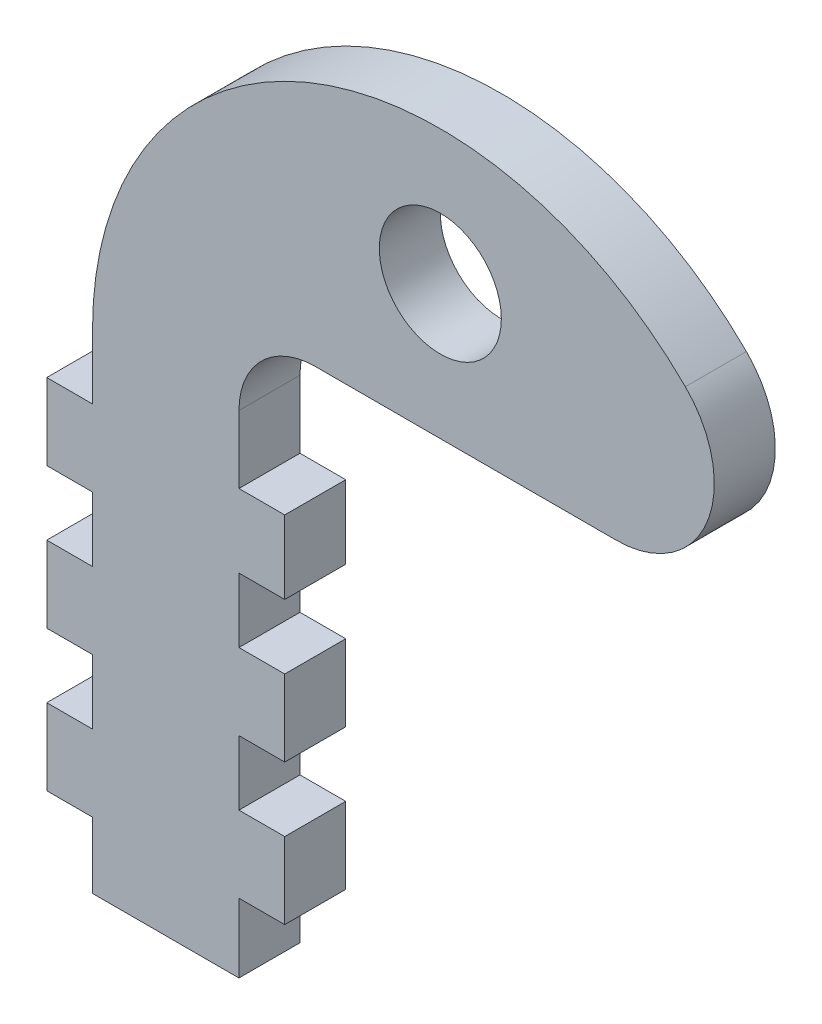
ISO-10303-21;
HEADER;
FILE_DESCRIPTION(('STEP AP214'),'2;1');
FILE_NAME('part.step','',(''),(''),'','','');
FILE_SCHEMA(('AUTOMOTIVE_DESIGN { 1 0 10303 214 1 1 1 1 }'));
ENDSEC;
DATA;
#1=APPLICATION_CONTEXT('core data for automotive mechanical design processes');
#2=APPLICATION_PROTOCOL_DEFINITION('international standard','automotive_design',2000,#1);
#3=PRODUCT_CONTEXT('',#1,'mechanical');
#4=PRODUCT('Part','Part','',(#3));
#5=PRODUCT_RELATED_PRODUCT_CATEGORY('part','',(#4));
#6=PRODUCT_DEFINITION_FORMATION('','',#4);
#7=PRODUCT_DEFINITION_CONTEXT('part definition',#1,'design');
#8=PRODUCT_DEFINITION('design','',#6,#7);
#9=PRODUCT_DEFINITION_SHAPE('','',#8);
#10=(LENGTH_UNIT() NAMED_UNIT(*) SI_UNIT(.MILLI.,.METRE.));
#11=(NAMED_UNIT(*) PLANE_ANGLE_UNIT() SI_UNIT($,.RADIAN.));
#12=(NAMED_UNIT(*) SI_UNIT($,.STERADIAN.) SOLID_ANGLE_UNIT());
#13=UNCERTAINTY_MEASURE_WITH_UNIT(LENGTH_MEASURE(1.E-05),#10,'distance_accuracy_value','');
#14=(GEOMETRIC_REPRESENTATION_CONTEXT(3) GLOBAL_UNCERTAINTY_ASSIGNED_CONTEXT((#13)) GLOBAL_UNIT_ASSIGNED_CONTEXT((#10,
#11,#12)) REPRESENTATION_CONTEXT('',''));
#15=CARTESIAN_POINT('',(0.,0.,0.));
#16=DIRECTION('',(0.,0.,1.));
#17=DIRECTION('',(1.,0.,0.));
#18=AXIS2_PLACEMENT_3D('',#15,#16,#17);
#19=CARTESIAN_POINT('',(0.,-23.23,4.));
#20=DIRECTION('',(0.,-1.,0.));
#21=DIRECTION('',(0.,0.,-1.));
#22=AXIS2_PLACEMENT_3D('',#19,#20,#21);
#23=PLANE('',#22);
#24=DIRECTION('',(-1.,0.,0.));
#25=VECTOR('',#24,1.);
#26=CARTESIAN_POINT('',(0.,-23.23,0.));
#27=LINE('',#26,#25);
#28=CARTESIAN_POINT('',(-4.8,-23.23,0.));
#29=VERTEX_POINT('',#28);
#30=CARTESIAN_POINT('',(-7.8,-23.23,0.));
#31=VERTEX_POINT('',#30);
#32=EDGE_CURVE('E271',#29,#31,#27,.T.);
#33=ORIENTED_EDGE('',*,*,#32,.F.);
#34=DIRECTION('',(0.,0.,-1.));
#35=VECTOR('',#34,1.);
#36=CARTESIAN_POINT('',(-4.8,-23.23,4.));
#37=LINE('',#36,#35);
#38=CARTESIAN_POINT('',(-4.8,-23.23,4.));
#39=VERTEX_POINT('',#38);
#40=EDGE_CURVE('E11',#39,#29,#37,.T.);
#41=ORIENTED_EDGE('',*,*,#40,.F.);
#42=DIRECTION('',(-1.,0.,0.));
#43=VECTOR('',#42,1.);
#44=CARTESIAN_POINT('',(0.,-23.23,4.));
#45=LINE('',#44,#43);
#46=CARTESIAN_POINT('',(-7.8,-23.23,4.));
#47=VERTEX_POINT('',#46);
#48=EDGE_CURVE('E360',#39,#47,#45,.T.);
#49=ORIENTED_EDGE('',*,*,#48,.T.);
#50=DIRECTION('',(0.,0.,-1.));
#51=VECTOR('',#50,1.);
#52=CARTESIAN_POINT('',(-7.8,-23.23,4.));
#53=LINE('',#52,#51);
#54=EDGE_CURVE('E52',#47,#31,#53,.T.);
#55=ORIENTED_EDGE('',*,*,#54,.T.);
#56=EDGE_LOOP('',(#33,#41,#49,#55));
#57=FACE_BOUND('',#56,.T.);
#58=ADVANCED_FACE('F36',(#57),#23,.T.);
#59=CARTESIAN_POINT('',(-4.80000000000001,0.,4.));
#60=DIRECTION('',(1.,0.,0.));
#61=DIRECTION('',(0.,1.,0.));
#62=AXIS2_PLACEMENT_3D('',#59,#60,#61);
#63=PLANE('',#62);
#64=DIRECTION('',(0.,-1.,0.));
#65=VECTOR('',#64,1.);
#66=CARTESIAN_POINT('',(-4.80000000000001,0.,0.));
#67=LINE('',#66,#65);
#68=CARTESIAN_POINT('',(-4.8,-27.46,0.));
#69=VERTEX_POINT('',#68);
#70=EDGE_CURVE('E273',#29,#69,#67,.T.);
#71=ORIENTED_EDGE('',*,*,#70,.T.);
#72=DIRECTION('',(0.,0.,-1.));
#73=VECTOR('',#72,1.);
#74=CARTESIAN_POINT('',(-4.8,-27.46,4.));
#75=LINE('',#74,#73);
#76=CARTESIAN_POINT('',(-4.8,-27.46,4.));
#77=VERTEX_POINT('',#76);
#78=EDGE_CURVE('E44',#77,#69,#75,.T.);
#79=ORIENTED_EDGE('',*,*,#78,.F.);
#80=DIRECTION('',(0.,-1.,0.));
#81=VECTOR('',#80,1.);
#82=CARTESIAN_POINT('',(-4.80000000000001,0.,4.));
#83=LINE('',#82,#81);
#84=EDGE_CURVE('E439',#39,#77,#83,.T.);
#85=ORIENTED_EDGE('',*,*,#84,.F.);
#86=ORIENTED_EDGE('',*,*,#40,.T.);
#87=EDGE_LOOP('',(#71,#79,#85,#86));
#88=FACE_BOUND('',#87,.T.);
#89=ADVANCED_FACE('F425',(#88),#63,.F.);
#90=CARTESIAN_POINT('',(0.,-27.46,4.));
#91=DIRECTION('',(0.,1.,0.));
#92=DIRECTION('',(0.,0.,1.));
#93=AXIS2_PLACEMENT_3D('',#90,#91,#92);
#94=PLANE('',#93);
#95=DIRECTION('',(1.,0.,0.));
#96=VECTOR('',#95,1.);
#97=CARTESIAN_POINT('',(0.,-27.46,0.));
#98=LINE('',#97,#96);
#99=CARTESIAN_POINT('',(-7.8,-27.46,0.));
#100=VERTEX_POINT('',#99);
#101=EDGE_CURVE('E276',#100,#69,#98,.T.);
#102=ORIENTED_EDGE('',*,*,#101,.F.);
#103=DIRECTION('',(0.,0.,-1.));
#104=VECTOR('',#103,1.);
#105=CARTESIAN_POINT('',(-7.8,-27.46,4.));
#106=LINE('',#105,#104);
#107=CARTESIAN_POINT('',(-7.8,-27.46,4.));
#108=VERTEX_POINT('',#107);
#109=EDGE_CURVE('E415',#108,#100,#106,.T.);
#110=ORIENTED_EDGE('',*,*,#109,.F.);
#111=DIRECTION('',(1.,0.,0.));
#112=VECTOR('',#111,1.);
#113=CARTESIAN_POINT('',(0.,-27.46,4.));
#114=LINE('',#113,#112);
#115=EDGE_CURVE('E422',#108,#77,#114,.T.);
#116=ORIENTED_EDGE('',*,*,#115,.T.);
#117=ORIENTED_EDGE('',*,*,#78,.T.);
#118=EDGE_LOOP('',(#102,#110,#116,#117));
#119=FACE_BOUND('',#118,.T.);
#120=ADVANCED_FACE('F420',(#119),#94,.T.);
#121=CARTESIAN_POINT('',(-7.8,0.,4.));
#122=DIRECTION('',(-1.,0.,0.));
#123=DIRECTION('',(0.,0.,1.));
#124=AXIS2_PLACEMENT_3D('',#121,#122,#123);
#125=PLANE('',#124);
#126=DIRECTION('',(0.,1.,0.));
#127=VECTOR('',#126,1.);
#128=CARTESIAN_POINT('',(-7.8,0.,0.));
#129=LINE('',#128,#127);
#130=CARTESIAN_POINT('',(-7.8,-32.46,0.));
#131=VERTEX_POINT('',#130);
#132=EDGE_CURVE('E279',#131,#100,#129,.T.);
#133=ORIENTED_EDGE('',*,*,#132,.F.);
#134=DIRECTION('',(0.,0.,-1.));
#135=VECTOR('',#134,1.);
#136=CARTESIAN_POINT('',(-7.8,-32.46,4.));
#137=LINE('',#136,#135);
#138=CARTESIAN_POINT('',(-7.8,-32.46,4.));
#139=VERTEX_POINT('',#138);
#140=EDGE_CURVE('E413',#139,#131,#137,.T.);
#141=ORIENTED_EDGE('',*,*,#140,.F.);
#142=DIRECTION('',(0.,1.,0.));
#143=VECTOR('',#142,1.);
#144=CARTESIAN_POINT('',(-7.8,0.,4.));
#145=LINE('',#144,#143);
#146=EDGE_CURVE('E436',#139,#108,#145,.T.);
#147=ORIENTED_EDGE('',*,*,#146,.T.);
#148=ORIENTED_EDGE('',*,*,#109,.T.);
#149=EDGE_LOOP('',(#133,#141,#147,#148));
#150=FACE_BOUND('',#149,.T.);
#151=ADVANCED_FACE('F433',(#150),#125,.T.);
#152=CARTESIAN_POINT('',(0.,-32.46,4.));
#153=DIRECTION('',(0.,-1.,0.));
#154=DIRECTION('',(0.,0.,-1.));
#155=AXIS2_PLACEMENT_3D('',#152,#153,#154);
#156=PLANE('',#155);
#157=DIRECTION('',(-1.,0.,0.));
#158=VECTOR('',#157,1.);
#159=CARTESIAN_POINT('',(0.,-32.46,0.));
#160=LINE('',#159,#158);
#161=CARTESIAN_POINT('',(-4.79999999999999,-32.46,0.));
#162=VERTEX_POINT('',#161);
#163=EDGE_CURVE('E282',#162,#131,#160,.T.);
#164=ORIENTED_EDGE('',*,*,#163,.F.);
#165=DIRECTION('',(0.,0.,-1.));
#166=VECTOR('',#165,1.);
#167=CARTESIAN_POINT('',(-4.79999999999999,-32.46,4.));
#168=LINE('',#167,#166);
#169=CARTESIAN_POINT('',(-4.79999999999999,-32.46,4.));
#170=VERTEX_POINT('',#169);
#171=EDGE_CURVE('E411',#170,#162,#168,.T.);
#172=ORIENTED_EDGE('',*,*,#171,.F.);
#173=DIRECTION('',(-1.,0.,0.));
#174=VECTOR('',#173,1.);
#175=CARTESIAN_POINT('',(0.,-32.46,4.));
#176=LINE('',#175,#174);
#177=EDGE_CURVE('E441',#170,#139,#176,.T.);
#178=ORIENTED_EDGE('',*,*,#177,.T.);
#179=ORIENTED_EDGE('',*,*,#140,.T.);
#180=EDGE_LOOP('',(#164,#172,#178,#179));
#181=FACE_BOUND('',#180,.T.);
#182=ADVANCED_FACE('F533',(#181),#156,.T.);
#183=CARTESIAN_POINT('',(-4.79999999999999,0.,4.));
#184=DIRECTION('',(1.,0.,0.));
#185=DIRECTION('',(0.,1.,0.));
#186=AXIS2_PLACEMENT_3D('',#183,#184,#185);
#187=PLANE('',#186);
#188=DIRECTION('',(0.,-1.,0.));
#189=VECTOR('',#188,1.);
#190=CARTESIAN_POINT('',(-4.79999999999999,0.,0.));
#191=LINE('',#190,#189);
#192=CARTESIAN_POINT('',(-4.79999999999999,-36.69,0.));
#193=VERTEX_POINT('',#192);
#194=EDGE_CURVE('E285',#162,#193,#191,.T.);
#195=ORIENTED_EDGE('',*,*,#194,.T.);
#196=DIRECTION('',(0.,0.,-1.));
#197=VECTOR('',#196,1.);
#198=CARTESIAN_POINT('',(-4.79999999999999,-36.69,4.));
#199=LINE('',#198,#197);
#200=CARTESIAN_POINT('',(-4.79999999999999,-36.69,4.));
#201=VERTEX_POINT('',#200);
#202=EDGE_CURVE('E409',#201,#193,#199,.T.);
#203=ORIENTED_EDGE('',*,*,#202,.F.);
#204=DIRECTION('',(0.,-1.,0.));
#205=VECTOR('',#204,1.);
#206=CARTESIAN_POINT('',(-4.79999999999999,0.,4.));
#207=LINE('',#206,#205);
#208=EDGE_CURVE('E447',#170,#201,#207,.T.);
#209=ORIENTED_EDGE('',*,*,#208,.F.);
#210=ORIENTED_EDGE('',*,*,#171,.T.);
#211=EDGE_LOOP('',(#195,#203,#209,#210));
#212=FACE_BOUND('',#211,.T.);
#213=ADVANCED_FACE('F536',(#212),#187,.F.);
#214=CARTESIAN_POINT('',(0.,-36.69,4.));
#215=DIRECTION('',(0.,1.,0.));
#216=DIRECTION('',(0.,0.,1.));
#217=AXIS2_PLACEMENT_3D('',#214,#215,#216);
#218=PLANE('',#217);
#219=DIRECTION('',(1.,0.,0.));
#220=VECTOR('',#219,1.);
#221=CARTESIAN_POINT('',(0.,-36.69,0.));
#222=LINE('',#221,#220);
#223=CARTESIAN_POINT('',(-7.8,-36.69,0.));
#224=VERTEX_POINT('',#223);
#225=EDGE_CURVE('E288',#224,#193,#222,.T.);
#226=ORIENTED_EDGE('',*,*,#225,.F.);
#227=DIRECTION('',(0.,0.,-1.));
#228=VECTOR('',#227,1.);
#229=CARTESIAN_POINT('',(-7.8,-36.69,4.));
#230=LINE('',#229,#228);
#231=CARTESIAN_POINT('',(-7.8,-36.69,4.));
#232=VERTEX_POINT('',#231);
#233=EDGE_CURVE('E407',#232,#224,#230,.T.);
#234=ORIENTED_EDGE('',*,*,#233,.F.);
#235=DIRECTION('',(1.,0.,0.));
#236=VECTOR('',#235,1.);
#237=CARTESIAN_POINT('',(0.,-36.69,4.));
#238=LINE('',#237,#236);
#239=EDGE_CURVE('E449',#232,#201,#238,.T.);
#240=ORIENTED_EDGE('',*,*,#239,.T.);
#241=ORIENTED_EDGE('',*,*,#202,.T.);
#242=EDGE_LOOP('',(#226,#234,#240,#241));
#243=FACE_BOUND('',#242,.T.);
#244=ADVANCED_FACE('F540',(#243),#218,.T.);
#245=CARTESIAN_POINT('',(-7.8,0.,4.));
#246=DIRECTION('',(-1.,0.,0.));
#247=DIRECTION('',(0.,0.,1.));
#248=AXIS2_PLACEMENT_3D('',#245,#246,#247);
#249=PLANE('',#248);
#250=DIRECTION('',(0.,1.,0.));
#251=VECTOR('',#250,1.);
#252=CARTESIAN_POINT('',(-7.8,0.,0.));
#253=LINE('',#252,#251);
#254=CARTESIAN_POINT('',(-7.8,-41.69,0.));
#255=VERTEX_POINT('',#254);
#256=EDGE_CURVE('E291',#255,#224,#253,.T.);
#257=ORIENTED_EDGE('',*,*,#256,.F.);
#258=DIRECTION('',(0.,0.,-1.));
#259=VECTOR('',#258,1.);
#260=CARTESIAN_POINT('',(-7.8,-41.69,4.));
#261=LINE('',#260,#259);
#262=CARTESIAN_POINT('',(-7.8,-41.69,4.));
#263=VERTEX_POINT('',#262);
#264=EDGE_CURVE('E405',#263,#255,#261,.T.);
#265=ORIENTED_EDGE('',*,*,#264,.F.);
#266=DIRECTION('',(0.,1.,0.));
#267=VECTOR('',#266,1.);
#268=CARTESIAN_POINT('',(-7.8,0.,4.));
#269=LINE('',#268,#267);
#270=EDGE_CURVE('E452',#263,#232,#269,.T.);
#271=ORIENTED_EDGE('',*,*,#270,.T.);
#272=ORIENTED_EDGE('',*,*,#233,.T.);
#273=EDGE_LOOP('',(#257,#265,#271,#272));
#274=FACE_BOUND('',#273,.T.);
#275=ADVANCED_FACE('F544',(#274),#249,.T.);
#276=CARTESIAN_POINT('',(0.,-41.69,4.));
#277=DIRECTION('',(0.,-1.,0.));
#278=DIRECTION('',(0.,0.,-1.));
#279=AXIS2_PLACEMENT_3D('',#276,#277,#278);
#280=PLANE('',#279);
#281=DIRECTION('',(-1.,0.,0.));
#282=VECTOR('',#281,1.);
#283=CARTESIAN_POINT('',(0.,-41.69,0.));
#284=LINE('',#283,#282);
#285=CARTESIAN_POINT('',(-4.79999999999999,-41.69,0.));
#286=VERTEX_POINT('',#285);
#287=EDGE_CURVE('E294',#286,#255,#284,.T.);
#288=ORIENTED_EDGE('',*,*,#287,.F.);
#289=DIRECTION('',(0.,0.,-1.));
#290=VECTOR('',#289,1.);
#291=CARTESIAN_POINT('',(-4.79999999999999,-41.69,4.));
#292=LINE('',#291,#290);
#293=CARTESIAN_POINT('',(-4.79999999999999,-41.69,4.));
#294=VERTEX_POINT('',#293);
#295=EDGE_CURVE('E403',#294,#286,#292,.T.);
#296=ORIENTED_EDGE('',*,*,#295,.F.);
#297=DIRECTION('',(-1.,0.,0.));
#298=VECTOR('',#297,1.);
#299=CARTESIAN_POINT('',(0.,-41.69,4.));
#300=LINE('',#299,#298);
#301=EDGE_CURVE('E455',#294,#263,#300,.T.);
#302=ORIENTED_EDGE('',*,*,#301,.T.);
#303=ORIENTED_EDGE('',*,*,#264,.T.);
#304=EDGE_LOOP('',(#288,#296,#302,#303));
#305=FACE_BOUND('',#304,.T.);
#306=ADVANCED_FACE('F548',(#305),#280,.T.);
#307=CARTESIAN_POINT('',(-4.79999999999995,0.,4.));
#308=DIRECTION('',(1.,0.,0.));
#309=DIRECTION('',(0.,1.,0.));
#310=AXIS2_PLACEMENT_3D('',#307,#308,#309);
#311=PLANE('',#310);
#312=DIRECTION('',(0.,-1.,0.));
#313=VECTOR('',#312,1.);
#314=CARTESIAN_POINT('',(-4.79999999999995,0.,0.));
#315=LINE('',#314,#313);
#316=CARTESIAN_POINT('',(-4.8,-46.02,0.));
#317=VERTEX_POINT('',#316);
#318=EDGE_CURVE('E297',#286,#317,#315,.T.);
#319=ORIENTED_EDGE('',*,*,#318,.T.);
#320=DIRECTION('',(0.,0.,-1.));
#321=VECTOR('',#320,1.);
#322=CARTESIAN_POINT('',(-4.8,-46.02,4.));
#323=LINE('',#322,#321);
#324=CARTESIAN_POINT('',(-4.8,-46.02,4.));
#325=VERTEX_POINT('',#324);
#326=EDGE_CURVE('E400',#325,#317,#323,.T.);
#327=ORIENTED_EDGE('',*,*,#326,.F.);
#328=DIRECTION('',(0.,-1.,0.));
#329=VECTOR('',#328,1.);
#330=CARTESIAN_POINT('',(-4.79999999999995,0.,4.));
#331=LINE('',#330,#329);
#332=EDGE_CURVE('E458',#294,#325,#331,.T.);
#333=ORIENTED_EDGE('',*,*,#332,.F.);
#334=ORIENTED_EDGE('',*,*,#295,.T.);
#335=EDGE_LOOP('',(#319,#327,#333,#334));
#336=FACE_BOUND('',#335,.T.);
#337=ADVANCED_FACE('F552',(#336),#311,.F.);
#338=CARTESIAN_POINT('',(0.,-46.02,4.));
#339=DIRECTION('',(0.,1.,0.));
#340=DIRECTION('',(0.,0.,1.));
#341=AXIS2_PLACEMENT_3D('',#338,#339,#340);
#342=PLANE('',#341);
#343=DIRECTION('',(1.,0.,0.));
#344=VECTOR('',#343,1.);
#345=CARTESIAN_POINT('',(0.,-46.02,0.));
#346=LINE('',#345,#344);
#347=CARTESIAN_POINT('',(4.8,-46.02,0.));
#348=VERTEX_POINT('',#347);
#349=EDGE_CURVE('E299',#317,#348,#346,.T.);
#350=ORIENTED_EDGE('',*,*,#349,.T.);
#351=DIRECTION('',(0.,0.,-1.));
#352=VECTOR('',#351,1.);
#353=CARTESIAN_POINT('',(4.8,-46.02,4.));
#354=LINE('',#353,#352);
#355=CARTESIAN_POINT('',(4.8,-46.02,4.));
#356=VERTEX_POINT('',#355);
#357=EDGE_CURVE('E398',#356,#348,#354,.T.);
#358=ORIENTED_EDGE('',*,*,#357,.F.);
#359=DIRECTION('',(1.,0.,0.));
#360=VECTOR('',#359,1.);
#361=CARTESIAN_POINT('',(0.,-46.02,4.));
#362=LINE('',#361,#360);
#363=EDGE_CURVE('E460',#325,#356,#362,.T.);
#364=ORIENTED_EDGE('',*,*,#363,.F.);
#365=ORIENTED_EDGE('',*,*,#326,.T.);
#366=EDGE_LOOP('',(#350,#358,#364,#365));
#367=FACE_BOUND('',#366,.T.);
#368=ADVANCED_FACE('F556',(#367),#342,.F.);
#369=CARTESIAN_POINT('',(4.80000000000003,0.,4.));
#370=DIRECTION('',(1.,0.,0.));
#371=DIRECTION('',(0.,1.,0.));
#372=AXIS2_PLACEMENT_3D('',#369,#370,#371);
#373=PLANE('',#372);
#374=DIRECTION('',(0.,-1.,0.));
#375=VECTOR('',#374,1.);
#376=CARTESIAN_POINT('',(4.80000000000003,0.,0.));
#377=LINE('',#376,#375);
#378=CARTESIAN_POINT('',(4.8,-41.4899999999942,0.));
#379=VERTEX_POINT('',#378);
#380=EDGE_CURVE('E302',#379,#348,#377,.T.);
#381=ORIENTED_EDGE('',*,*,#380,.F.);
#382=DIRECTION('',(0.,0.,-1.));
#383=VECTOR('',#382,1.);
#384=CARTESIAN_POINT('',(4.8,-41.4899999999942,4.));
#385=LINE('',#384,#383);
#386=CARTESIAN_POINT('',(4.8,-41.4899999999942,4.));
#387=VERTEX_POINT('',#386);
#388=EDGE_CURVE('E396',#387,#379,#385,.T.);
#389=ORIENTED_EDGE('',*,*,#388,.F.);
#390=DIRECTION('',(0.,-1.,0.));
#391=VECTOR('',#390,1.);
#392=CARTESIAN_POINT('',(4.80000000000003,0.,4.));
#393=LINE('',#392,#391);
#394=EDGE_CURVE('E462',#387,#356,#393,.T.);
#395=ORIENTED_EDGE('',*,*,#394,.T.);
#396=ORIENTED_EDGE('',*,*,#357,.T.);
#397=EDGE_LOOP('',(#381,#389,#395,#396));
#398=FACE_BOUND('',#397,.T.);
#399=ADVANCED_FACE('F560',(#398),#373,.T.);
#400=CARTESIAN_POINT('',(0.,-41.4899999999942,4.));
#401=DIRECTION('',(0.,-1.,0.));
#402=DIRECTION('',(0.,0.,-1.));
#403=AXIS2_PLACEMENT_3D('',#400,#401,#402);
#404=PLANE('',#403);
#405=DIRECTION('',(-1.,0.,0.));
#406=VECTOR('',#405,1.);
#407=CARTESIAN_POINT('',(0.,-41.4899999999942,0.));
#408=LINE('',#407,#406);
#409=CARTESIAN_POINT('',(7.8,-41.4899999999942,0.));
#410=VERTEX_POINT('',#409);
#411=EDGE_CURVE('E305',#410,#379,#408,.T.);
#412=ORIENTED_EDGE('',*,*,#411,.F.);
#413=DIRECTION('',(0.,0.,-1.));
#414=VECTOR('',#413,1.);
#415=CARTESIAN_POINT('',(7.8,-41.4899999999942,4.));
#416=LINE('',#415,#414);
#417=CARTESIAN_POINT('',(7.8,-41.4899999999942,4.));
#418=VERTEX_POINT('',#417);
#419=EDGE_CURVE('E394',#418,#410,#416,.T.);
#420=ORIENTED_EDGE('',*,*,#419,.F.);
#421=DIRECTION('',(-1.,0.,0.));
#422=VECTOR('',#421,1.);
#423=CARTESIAN_POINT('',(0.,-41.4899999999942,4.));
#424=LINE('',#423,#422);
#425=EDGE_CURVE('E465',#418,#387,#424,.T.);
#426=ORIENTED_EDGE('',*,*,#425,.T.);
#427=ORIENTED_EDGE('',*,*,#388,.T.);
#428=EDGE_LOOP('',(#412,#420,#426,#427));
#429=FACE_BOUND('',#428,.T.);
#430=ADVANCED_FACE('F564',(#429),#404,.T.);
#431=CARTESIAN_POINT('',(7.8,0.,4.));
#432=DIRECTION('',(1.,0.,0.));
#433=DIRECTION('',(0.,0.,-1.));
#434=AXIS2_PLACEMENT_3D('',#431,#432,#433);
#435=PLANE('',#434);
#436=DIRECTION('',(0.,-1.,0.));
#437=VECTOR('',#436,1.);
#438=CARTESIAN_POINT('',(7.8,0.,0.));
#439=LINE('',#438,#437);
#440=CARTESIAN_POINT('',(7.8,-36.49,0.));
#441=VERTEX_POINT('',#440);
#442=EDGE_CURVE('E308',#441,#410,#439,.T.);
#443=ORIENTED_EDGE('',*,*,#442,.F.);
#444=DIRECTION('',(0.,0.,-1.));
#445=VECTOR('',#444,1.);
#446=CARTESIAN_POINT('',(7.8,-36.49,4.));
#447=LINE('',#446,#445);
#448=CARTESIAN_POINT('',(7.8,-36.49,4.));
#449=VERTEX_POINT('',#448);
#450=EDGE_CURVE('E392',#449,#441,#447,.T.);
#451=ORIENTED_EDGE('',*,*,#450,.F.);
#452=DIRECTION('',(0.,-1.,0.));
#453=VECTOR('',#452,1.);
#454=CARTESIAN_POINT('',(7.8,0.,4.));
#455=LINE('',#454,#453);
#456=EDGE_CURVE('E468',#449,#418,#455,.T.);
#457=ORIENTED_EDGE('',*,*,#456,.T.);
#458=ORIENTED_EDGE('',*,*,#419,.T.);
#459=EDGE_LOOP('',(#443,#451,#457,#458));
#460=FACE_BOUND('',#459,.T.);
#461=ADVANCED_FACE('F568',(#460),#435,.T.);
#462=CARTESIAN_POINT('',(0.,-36.49,4.));
#463=DIRECTION('',(0.,1.,0.));
#464=DIRECTION('',(0.,0.,1.));
#465=AXIS2_PLACEMENT_3D('',#462,#463,#464);
#466=PLANE('',#465);
#467=DIRECTION('',(1.,0.,0.));
#468=VECTOR('',#467,1.);
#469=CARTESIAN_POINT('',(0.,-36.49,0.));
#470=LINE('',#469,#468);
#471=CARTESIAN_POINT('',(4.8,-36.49,0.));
#472=VERTEX_POINT('',#471);
#473=EDGE_CURVE('E311',#472,#441,#470,.T.);
#474=ORIENTED_EDGE('',*,*,#473,.F.);
#475=DIRECTION('',(0.,0.,-1.));
#476=VECTOR('',#475,1.);
#477=CARTESIAN_POINT('',(4.8,-36.49,4.));
#478=LINE('',#477,#476);
#479=CARTESIAN_POINT('',(4.8,-36.49,4.));
#480=VERTEX_POINT('',#479);
#481=EDGE_CURVE('E390',#480,#472,#478,.T.);
#482=ORIENTED_EDGE('',*,*,#481,.F.);
#483=DIRECTION('',(1.,0.,0.));
#484=VECTOR('',#483,1.);
#485=CARTESIAN_POINT('',(0.,-36.49,4.));
#486=LINE('',#485,#484);
#487=EDGE_CURVE('E471',#480,#449,#486,.T.);
#488=ORIENTED_EDGE('',*,*,#487,.T.);
#489=ORIENTED_EDGE('',*,*,#450,.T.);
#490=EDGE_LOOP('',(#474,#482,#488,#489));
#491=FACE_BOUND('',#490,.T.);
#492=ADVANCED_FACE('F572',(#491),#466,.T.);
#493=CARTESIAN_POINT('',(4.8,0.,4.));
#494=DIRECTION('',(1.,0.,0.));
#495=DIRECTION('',(0.,0.,-1.));
#496=AXIS2_PLACEMENT_3D('',#493,#494,#495);
#497=PLANE('',#496);
#498=DIRECTION('',(0.,-1.,0.));
#499=VECTOR('',#498,1.);
#500=CARTESIAN_POINT('',(4.8,0.,0.));
#501=LINE('',#500,#499);
#502=CARTESIAN_POINT('',(4.8,-32.2599999999931,0.));
#503=VERTEX_POINT('',#502);
#504=EDGE_CURVE('E314',#503,#472,#501,.T.);
#505=ORIENTED_EDGE('',*,*,#504,.F.);
#506=DIRECTION('',(0.,0.,-1.));
#507=VECTOR('',#506,1.);
#508=CARTESIAN_POINT('',(4.8,-32.2599999999931,4.));
#509=LINE('',#508,#507);
#510=CARTESIAN_POINT('',(4.8,-32.2599999999931,4.));
#511=VERTEX_POINT('',#510);
#512=EDGE_CURVE('E388',#511,#503,#509,.T.);
#513=ORIENTED_EDGE('',*,*,#512,.F.);
#514=DIRECTION('',(0.,-1.,0.));
#515=VECTOR('',#514,1.);
#516=CARTESIAN_POINT('',(4.8,0.,4.));
#517=LINE('',#516,#515);
#518=EDGE_CURVE('E474',#511,#480,#517,.T.);
#519=ORIENTED_EDGE('',*,*,#518,.T.);
#520=ORIENTED_EDGE('',*,*,#481,.T.);
#521=EDGE_LOOP('',(#505,#513,#519,#520));
#522=FACE_BOUND('',#521,.T.);
#523=ADVANCED_FACE('F576',(#522),#497,.T.);
#524=CARTESIAN_POINT('',(0.,-32.2599999999931,4.));
#525=DIRECTION('',(0.,-1.,0.));
#526=DIRECTION('',(0.,0.,-1.));
#527=AXIS2_PLACEMENT_3D('',#524,#525,#526);
#528=PLANE('',#527);
#529=DIRECTION('',(-1.,0.,0.));
#530=VECTOR('',#529,1.);
#531=CARTESIAN_POINT('',(0.,-32.2599999999931,0.));
#532=LINE('',#531,#530);
#533=CARTESIAN_POINT('',(7.8,-32.2599999999931,0.));
#534=VERTEX_POINT('',#533);
#535=EDGE_CURVE('E317',#534,#503,#532,.T.);
#536=ORIENTED_EDGE('',*,*,#535,.F.);
#537=DIRECTION('',(0.,0.,-1.));
#538=VECTOR('',#537,1.);
#539=CARTESIAN_POINT('',(7.8,-32.2599999999931,4.));
#540=LINE('',#539,#538);
#541=CARTESIAN_POINT('',(7.8,-32.2599999999931,4.));
#542=VERTEX_POINT('',#541);
#543=EDGE_CURVE('E386',#542,#534,#540,.T.);
#544=ORIENTED_EDGE('',*,*,#543,.F.);
#545=DIRECTION('',(-1.,0.,0.));
#546=VECTOR('',#545,1.);
#547=CARTESIAN_POINT('',(0.,-32.2599999999931,4.));
#548=LINE('',#547,#546);
#549=EDGE_CURVE('E477',#542,#511,#548,.T.);
#550=ORIENTED_EDGE('',*,*,#549,.T.);
#551=ORIENTED_EDGE('',*,*,#512,.T.);
#552=EDGE_LOOP('',(#536,#544,#550,#551));
#553=FACE_BOUND('',#552,.T.);
#554=ADVANCED_FACE('F580',(#553),#528,.T.);
#555=CARTESIAN_POINT('',(7.8,0.,4.));
#556=DIRECTION('',(1.,0.,0.));
#557=DIRECTION('',(0.,0.,-1.));
#558=AXIS2_PLACEMENT_3D('',#555,#556,#557);
#559=PLANE('',#558);
#560=DIRECTION('',(0.,-1.,0.));
#561=VECTOR('',#560,1.);
#562=CARTESIAN_POINT('',(7.8,0.,0.));
#563=LINE('',#562,#561);
#564=CARTESIAN_POINT('',(7.8,-27.26,0.));
#565=VERTEX_POINT('',#564);
#566=EDGE_CURVE('E320',#565,#534,#563,.T.);
#567=ORIENTED_EDGE('',*,*,#566,.F.);
#568=DIRECTION('',(0.,0.,-1.));
#569=VECTOR('',#568,1.);
#570=CARTESIAN_POINT('',(7.8,-27.26,4.));
#571=LINE('',#570,#569);
#572=CARTESIAN_POINT('',(7.8,-27.26,4.));
#573=VERTEX_POINT('',#572);
#574=EDGE_CURVE('E384',#573,#565,#571,.T.);
#575=ORIENTED_EDGE('',*,*,#574,.F.);
#576=DIRECTION('',(0.,-1.,0.));
#577=VECTOR('',#576,1.);
#578=CARTESIAN_POINT('',(7.8,0.,4.));
#579=LINE('',#578,#577);
#580=EDGE_CURVE('E480',#573,#542,#579,.T.);
#581=ORIENTED_EDGE('',*,*,#580,.T.);
#582=ORIENTED_EDGE('',*,*,#543,.T.);
#583=EDGE_LOOP('',(#567,#575,#581,#582));
#584=FACE_BOUND('',#583,.T.);
#585=ADVANCED_FACE('F584',(#584),#559,.T.);
#586=CARTESIAN_POINT('',(0.,-27.26,4.));
#587=DIRECTION('',(0.,1.,0.));
#588=DIRECTION('',(0.,0.,1.));
#589=AXIS2_PLACEMENT_3D('',#586,#587,#588);
#590=PLANE('',#589);
#591=DIRECTION('',(1.,0.,0.));
#592=VECTOR('',#591,1.);
#593=CARTESIAN_POINT('',(0.,-27.26,0.));
#594=LINE('',#593,#592);
#595=CARTESIAN_POINT('',(4.8,-27.26,0.));
#596=VERTEX_POINT('',#595);
#597=EDGE_CURVE('E323',#596,#565,#594,.T.);
#598=ORIENTED_EDGE('',*,*,#597,.F.);
#599=DIRECTION('',(0.,0.,-1.));
#600=VECTOR('',#599,1.);
#601=CARTESIAN_POINT('',(4.8,-27.26,4.));
#602=LINE('',#601,#600);
#603=CARTESIAN_POINT('',(4.8,-27.26,4.));
#604=VERTEX_POINT('',#603);
#605=EDGE_CURVE('E382',#604,#596,#602,.T.);
#606=ORIENTED_EDGE('',*,*,#605,.F.);
#607=DIRECTION('',(1.,0.,0.));
#608=VECTOR('',#607,1.);
#609=CARTESIAN_POINT('',(0.,-27.26,4.));
#610=LINE('',#609,#608);
#611=EDGE_CURVE('E483',#604,#573,#610,.T.);
#612=ORIENTED_EDGE('',*,*,#611,.T.);
#613=ORIENTED_EDGE('',*,*,#574,.T.);
#614=EDGE_LOOP('',(#598,#606,#612,#613));
#615=FACE_BOUND('',#614,.T.);
#616=ADVANCED_FACE('F588',(#615),#590,.T.);
#617=CARTESIAN_POINT('',(4.8,0.,4.));
#618=DIRECTION('',(1.,0.,0.));
#619=DIRECTION('',(0.,1.,0.));
#620=AXIS2_PLACEMENT_3D('',#617,#618,#619);
#621=PLANE('',#620);
#622=DIRECTION('',(0.,-1.,0.));
#623=VECTOR('',#622,1.);
#624=CARTESIAN_POINT('',(4.8,0.,0.));
#625=LINE('',#624,#623);
#626=CARTESIAN_POINT('',(4.8,-23.0300000000062,0.));
#627=VERTEX_POINT('',#626);
#628=EDGE_CURVE('E326',#627,#596,#625,.T.);
#629=ORIENTED_EDGE('',*,*,#628,.F.);
#630=DIRECTION('',(0.,0.,-1.));
#631=VECTOR('',#630,1.);
#632=CARTESIAN_POINT('',(4.8,-23.0300000000062,4.));
#633=LINE('',#632,#631);
#634=CARTESIAN_POINT('',(4.8,-23.0300000000062,4.));
#635=VERTEX_POINT('',#634);
#636=EDGE_CURVE('E380',#635,#627,#633,.T.);
#637=ORIENTED_EDGE('',*,*,#636,.F.);
#638=DIRECTION('',(0.,-1.,0.));
#639=VECTOR('',#638,1.);
#640=CARTESIAN_POINT('',(4.8,0.,4.));
#641=LINE('',#640,#639);
#642=EDGE_CURVE('E486',#635,#604,#641,.T.);
#643=ORIENTED_EDGE('',*,*,#642,.T.);
#644=ORIENTED_EDGE('',*,*,#605,.T.);
#645=EDGE_LOOP('',(#629,#637,#643,#644));
#646=FACE_BOUND('',#645,.T.);
#647=ADVANCED_FACE('F592',(#646),#621,.T.);
#648=CARTESIAN_POINT('',(0.,-23.0300000000062,4.));
#649=DIRECTION('',(0.,-1.,0.));
#650=DIRECTION('',(0.,0.,-1.));
#651=AXIS2_PLACEMENT_3D('',#648,#649,#650);
#652=PLANE('',#651);
#653=DIRECTION('',(-1.,0.,0.));
#654=VECTOR('',#653,1.);
#655=CARTESIAN_POINT('',(0.,-23.0300000000062,0.));
#656=LINE('',#655,#654);
#657=CARTESIAN_POINT('',(7.8,-23.0300000000062,0.));
#658=VERTEX_POINT('',#657);
#659=EDGE_CURVE('E329',#658,#627,#656,.T.);
#660=ORIENTED_EDGE('',*,*,#659,.F.);
#661=DIRECTION('',(0.,0.,-1.));
#662=VECTOR('',#661,1.);
#663=CARTESIAN_POINT('',(7.8,-23.0300000000062,4.));
#664=LINE('',#663,#662);
#665=CARTESIAN_POINT('',(7.8,-23.0300000000062,4.));
#666=VERTEX_POINT('',#665);
#667=EDGE_CURVE('E378',#666,#658,#664,.T.);
#668=ORIENTED_EDGE('',*,*,#667,.F.);
#669=DIRECTION('',(-1.,0.,0.));
#670=VECTOR('',#669,1.);
#671=CARTESIAN_POINT('',(0.,-23.0300000000062,4.));
#672=LINE('',#671,#670);
#673=EDGE_CURVE('E489',#666,#635,#672,.T.);
#674=ORIENTED_EDGE('',*,*,#673,.T.);
#675=ORIENTED_EDGE('',*,*,#636,.T.);
#676=EDGE_LOOP('',(#660,#668,#674,#675));
#677=FACE_BOUND('',#676,.T.);
#678=ADVANCED_FACE('F596',(#677),#652,.T.);
#679=CARTESIAN_POINT('',(7.79999999999999,0.,4.));
#680=DIRECTION('',(1.,0.,0.));
#681=DIRECTION('',(0.,1.,0.));
#682=AXIS2_PLACEMENT_3D('',#679,#680,#681);
#683=PLANE('',#682);
#684=DIRECTION('',(0.,-1.,0.));
#685=VECTOR('',#684,1.);
#686=CARTESIAN_POINT('',(7.79999999999999,0.,0.));
#687=LINE('',#686,#685);
#688=CARTESIAN_POINT('',(7.8,-18.23,0.));
#689=VERTEX_POINT('',#688);
#690=EDGE_CURVE('E332',#689,#658,#687,.T.);
#691=ORIENTED_EDGE('',*,*,#690,.F.);
#692=DIRECTION('',(0.,0.,-1.));
#693=VECTOR('',#692,1.);
#694=CARTESIAN_POINT('',(7.8,-18.23,4.));
#695=LINE('',#694,#693);
#696=CARTESIAN_POINT('',(7.8,-18.23,4.));
#697=VERTEX_POINT('',#696);
#698=EDGE_CURVE('E376',#697,#689,#695,.T.);
#699=ORIENTED_EDGE('',*,*,#698,.F.);
#700=DIRECTION('',(0.,-1.,0.));
#701=VECTOR('',#700,1.);
#702=CARTESIAN_POINT('',(7.79999999999999,0.,4.));
#703=LINE('',#702,#701);
#704=EDGE_CURVE('E492',#697,#666,#703,.T.);
#705=ORIENTED_EDGE('',*,*,#704,.T.);
#706=ORIENTED_EDGE('',*,*,#667,.T.);
#707=EDGE_LOOP('',(#691,#699,#705,#706));
#708=FACE_BOUND('',#707,.T.);
#709=ADVANCED_FACE('F600',(#708),#683,.T.);
#710=CARTESIAN_POINT('',(0.,-18.23,4.));
#711=DIRECTION('',(0.,1.,0.));
#712=DIRECTION('',(0.,0.,1.));
#713=AXIS2_PLACEMENT_3D('',#710,#711,#712);
#714=PLANE('',#713);
#715=DIRECTION('',(1.,0.,0.));
#716=VECTOR('',#715,1.);
#717=CARTESIAN_POINT('',(0.,-18.23,0.));
#718=LINE('',#717,#716);
#719=CARTESIAN_POINT('',(4.8,-18.23,0.));
#720=VERTEX_POINT('',#719);
#721=EDGE_CURVE('E335',#720,#689,#718,.T.);
#722=ORIENTED_EDGE('',*,*,#721,.F.);
#723=DIRECTION('',(0.,0.,-1.));
#724=VECTOR('',#723,1.);
#725=CARTESIAN_POINT('',(4.8,-18.23,4.));
#726=LINE('',#725,#724);
#727=CARTESIAN_POINT('',(4.8,-18.23,4.));
#728=VERTEX_POINT('',#727);
#729=EDGE_CURVE('E374',#728,#720,#726,.T.);
#730=ORIENTED_EDGE('',*,*,#729,.F.);
#731=DIRECTION('',(1.,0.,0.));
#732=VECTOR('',#731,1.);
#733=CARTESIAN_POINT('',(0.,-18.23,4.));
#734=LINE('',#733,#732);
#735=EDGE_CURVE('E495',#728,#697,#734,.T.);
#736=ORIENTED_EDGE('',*,*,#735,.T.);
#737=ORIENTED_EDGE('',*,*,#698,.T.);
#738=EDGE_LOOP('',(#722,#730,#736,#737));
#739=FACE_BOUND('',#738,.T.);
#740=ADVANCED_FACE('F604',(#739),#714,.T.);
#741=CARTESIAN_POINT('',(4.8,0.,4.));
#742=DIRECTION('',(1.,0.,0.));
#743=DIRECTION('',(0.,1.,0.));
#744=AXIS2_PLACEMENT_3D('',#741,#742,#743);
#745=PLANE('',#744);
#746=DIRECTION('',(0.,-1.,0.));
#747=VECTOR('',#746,1.);
#748=CARTESIAN_POINT('',(4.8,0.,0.));
#749=LINE('',#748,#747);
#750=CARTESIAN_POINT('',(4.8,-13.8,0.));
#751=VERTEX_POINT('',#750);
#752=EDGE_CURVE('E338',#751,#720,#749,.T.);
#753=ORIENTED_EDGE('',*,*,#752,.F.);
#754=DIRECTION('',(0.,0.,-1.));
#755=VECTOR('',#754,1.);
#756=CARTESIAN_POINT('',(4.8,-13.8,4.));
#757=LINE('',#756,#755);
#758=CARTESIAN_POINT('',(4.8,-13.8,4.));
#759=VERTEX_POINT('',#758);
#760=EDGE_CURVE('E372',#759,#751,#757,.T.);
#761=ORIENTED_EDGE('',*,*,#760,.F.);
#762=DIRECTION('',(0.,-1.,0.));
#763=VECTOR('',#762,1.);
#764=CARTESIAN_POINT('',(4.8,0.,4.));
#765=LINE('',#764,#763);
#766=EDGE_CURVE('E498',#759,#728,#765,.T.);
#767=ORIENTED_EDGE('',*,*,#766,.T.);
#768=ORIENTED_EDGE('',*,*,#729,.T.);
#769=EDGE_LOOP('',(#753,#761,#767,#768));
#770=FACE_BOUND('',#769,.T.);
#771=ADVANCED_FACE('F608',(#770),#745,.T.);
#772=CARTESIAN_POINT('',(9.8,-13.8,4.));
#773=DIRECTION('',(0.,0.,-1.));
#774=DIRECTION('',(-1.,0.,0.));
#775=AXIS2_PLACEMENT_3D('',#772,#773,#774);
#776=CYLINDRICAL_SURFACE('',#775,5.);
#777=CARTESIAN_POINT('',(9.8,-13.8,0.));
#778=DIRECTION('',(0.,0.,1.));
#779=DIRECTION('',(1.,0.,0.));
#780=AXIS2_PLACEMENT_3D('',#777,#778,#779);
#781=CIRCLE('',#780,5.);
#782=CARTESIAN_POINT('',(9.8,-8.8,0.));
#783=VERTEX_POINT('',#782);
#784=EDGE_CURVE('E341',#751,#783,#781,.F.);
#785=ORIENTED_EDGE('',*,*,#784,.T.);
#786=DIRECTION('',(0.,0.,-1.));
#787=VECTOR('',#786,1.);
#788=CARTESIAN_POINT('',(9.8,-8.8,4.));
#789=LINE('',#788,#787);
#790=CARTESIAN_POINT('',(9.8,-8.8,4.));
#791=VERTEX_POINT('',#790);
#792=EDGE_CURVE('E369',#791,#783,#789,.T.);
#793=ORIENTED_EDGE('',*,*,#792,.F.);
#794=CARTESIAN_POINT('',(9.8,-13.8,4.));
#795=DIRECTION('',(0.,0.,1.));
#796=DIRECTION('',(1.,0.,0.));
#797=AXIS2_PLACEMENT_3D('',#794,#795,#796);
#798=CIRCLE('',#797,5.);
#799=EDGE_CURVE('E501',#759,#791,#798,.F.);
#800=ORIENTED_EDGE('',*,*,#799,.F.);
#801=ORIENTED_EDGE('',*,*,#760,.T.);
#802=EDGE_LOOP('',(#785,#793,#800,#801));
#803=FACE_BOUND('',#802,.T.);
#804=ADVANCED_FACE('F612',(#803),#776,.F.);
#805=CARTESIAN_POINT('',(0.,-8.8,4.));
#806=DIRECTION('',(0.,1.,0.));
#807=DIRECTION('',(0.,0.,1.));
#808=AXIS2_PLACEMENT_3D('',#805,#806,#807);
#809=PLANE('',#808);
#810=DIRECTION('',(1.,0.,0.));
#811=VECTOR('',#810,1.);
#812=CARTESIAN_POINT('',(0.,-8.8,0.));
#813=LINE('',#812,#811);
#814=CARTESIAN_POINT('',(29.4809408483732,-8.8,0.));
#815=VERTEX_POINT('',#814);
#816=EDGE_CURVE('E343',#783,#815,#813,.T.);
#817=ORIENTED_EDGE('',*,*,#816,.T.);
#818=DIRECTION('',(0.,0.,-1.));
#819=VECTOR('',#818,1.);
#820=CARTESIAN_POINT('',(29.4809408483732,-8.8,4.));
#821=LINE('',#820,#819);
#822=CARTESIAN_POINT('',(29.4809408483732,-8.8,4.));
#823=VERTEX_POINT('',#822);
#824=EDGE_CURVE('E366',#823,#815,#821,.T.);
#825=ORIENTED_EDGE('',*,*,#824,.F.);
#826=DIRECTION('',(1.,0.,0.));
#827=VECTOR('',#826,1.);
#828=CARTESIAN_POINT('',(0.,-8.8,4.));
#829=LINE('',#828,#827);
#830=EDGE_CURVE('E503',#791,#823,#829,.T.);
#831=ORIENTED_EDGE('',*,*,#830,.F.);
#832=ORIENTED_EDGE('',*,*,#792,.T.);
#833=EDGE_LOOP('',(#817,#825,#831,#832));
#834=FACE_BOUND('',#833,.T.);
#835=ADVANCED_FACE('F616',(#834),#809,.F.);
#836=CARTESIAN_POINT('',(29.5392876709509,-2.37792574406889,4.));
#837=DIRECTION('',(0.,0.,-1.));
#838=DIRECTION('',(-1.,0.,0.));
#839=AXIS2_PLACEMENT_3D('',#836,#837,#838);
#840=CYLINDRICAL_SURFACE('',#839,6.42233930125138);
#841=CARTESIAN_POINT('',(29.5392876709509,-2.37792574406889,0.));
#842=DIRECTION('',(0.,0.,1.));
#843=DIRECTION('',(1.,0.,0.));
#844=AXIS2_PLACEMENT_3D('',#841,#842,#843);
#845=CIRCLE('',#844,6.42233930125138);
#846=CARTESIAN_POINT('',(34.0643063583423,2.17955689211928,0.));
#847=VERTEX_POINT('',#846);
#848=EDGE_CURVE('E345',#815,#847,#845,.T.);
#849=ORIENTED_EDGE('',*,*,#848,.T.);
#850=DIRECTION('',(0.,0.,-1.));
#851=VECTOR('',#850,1.);
#852=CARTESIAN_POINT('',(34.0643063583423,2.17955689211928,4.));
#853=LINE('',#852,#851);
#854=CARTESIAN_POINT('',(34.0643063583423,2.17955689211928,4.));
#855=VERTEX_POINT('',#854);
#856=EDGE_CURVE('E364',#855,#847,#853,.T.);
#857=ORIENTED_EDGE('',*,*,#856,.F.);
#858=CARTESIAN_POINT('',(29.5392876709509,-2.37792574406889,4.));
#859=DIRECTION('',(0.,0.,1.));
#860=DIRECTION('',(1.,0.,0.));
#861=AXIS2_PLACEMENT_3D('',#858,#859,#860);
#862=CIRCLE('',#861,6.42233930125138);
#863=EDGE_CURVE('E505',#823,#855,#862,.T.);
#864=ORIENTED_EDGE('',*,*,#863,.F.);
#865=ORIENTED_EDGE('',*,*,#824,.T.);
#866=EDGE_LOOP('',(#849,#857,#864,#865));
#867=FACE_BOUND('',#866,.T.);
#868=ADVANCED_FACE('F620',(#867),#840,.T.);
#869=CARTESIAN_POINT('',(18.,-14.,4.));
#870=DIRECTION('',(0.,0.,-1.));
#871=DIRECTION('',(-1.,0.,0.));
#872=AXIS2_PLACEMENT_3D('',#869,#870,#871);
#873=CYLINDRICAL_SURFACE('',#872,22.8);
#874=CARTESIAN_POINT('',(18.,-14.,0.));
#875=DIRECTION('',(0.,0.,1.));
#876=DIRECTION('',(1.,0.,0.));
#877=AXIS2_PLACEMENT_3D('',#874,#875,#876);
#878=CIRCLE('',#877,22.8);
#879=CARTESIAN_POINT('',(-4.8,-14.,0.));
#880=VERTEX_POINT('',#879);
#881=EDGE_CURVE('E348',#880,#847,#878,.F.);
#882=ORIENTED_EDGE('',*,*,#881,.F.);
#883=DIRECTION('',(0.,0.,-1.));
#884=VECTOR('',#883,1.);
#885=CARTESIAN_POINT('',(-4.8,-14.,4.));
#886=LINE('',#885,#884);
#887=CARTESIAN_POINT('',(-4.8,-14.,4.));
#888=VERTEX_POINT('',#887);
#889=EDGE_CURVE('E260',#888,#880,#886,.T.);
#890=ORIENTED_EDGE('',*,*,#889,.F.);
#891=CARTESIAN_POINT('',(18.,-14.,4.));
#892=DIRECTION('',(0.,0.,1.));
#893=DIRECTION('',(1.,0.,0.));
#894=AXIS2_PLACEMENT_3D('',#891,#892,#893);
#895=CIRCLE('',#894,22.8);
#896=EDGE_CURVE('E250',#888,#855,#895,.F.);
#897=ORIENTED_EDGE('',*,*,#896,.T.);
#898=ORIENTED_EDGE('',*,*,#856,.T.);
#899=EDGE_LOOP('',(#882,#890,#897,#898));
#900=FACE_BOUND('',#899,.T.);
#901=ADVANCED_FACE('F508',(#900),#873,.T.);
#902=CARTESIAN_POINT('',(-4.8,0.,4.));
#903=DIRECTION('',(1.,0.,0.));
#904=DIRECTION('',(0.,0.,-1.));
#905=AXIS2_PLACEMENT_3D('',#902,#903,#904);
#906=PLANE('',#905);
#907=DIRECTION('',(0.,-1.,0.));
#908=VECTOR('',#907,1.);
#909=CARTESIAN_POINT('',(-4.8,0.,0.));
#910=LINE('',#909,#908);
#911=CARTESIAN_POINT('',(-4.8,-18.23,0.));
#912=VERTEX_POINT('',#911);
#913=EDGE_CURVE('E257',#880,#912,#910,.T.);
#914=ORIENTED_EDGE('',*,*,#913,.T.);
#915=DIRECTION('',(0.,0.,-1.));
#916=VECTOR('',#915,1.);
#917=CARTESIAN_POINT('',(-4.8,-18.23,4.));
#918=LINE('',#917,#916);
#919=CARTESIAN_POINT('',(-4.8,-18.23,4.));
#920=VERTEX_POINT('',#919);
#921=EDGE_CURVE('E254',#920,#912,#918,.T.);
#922=ORIENTED_EDGE('',*,*,#921,.F.);
#923=DIRECTION('',(0.,-1.,0.));
#924=VECTOR('',#923,1.);
#925=CARTESIAN_POINT('',(-4.8,0.,4.));
#926=LINE('',#925,#924);
#927=EDGE_CURVE('E241',#888,#920,#926,.T.);
#928=ORIENTED_EDGE('',*,*,#927,.F.);
#929=ORIENTED_EDGE('',*,*,#889,.T.);
#930=EDGE_LOOP('',(#914,#922,#928,#929));
#931=FACE_BOUND('',#930,.T.);
#932=ADVANCED_FACE('F255',(#931),#906,.F.);
#933=CARTESIAN_POINT('',(0.,-18.23,4.));
#934=DIRECTION('',(0.,1.,0.));
#935=DIRECTION('',(0.,0.,1.));
#936=AXIS2_PLACEMENT_3D('',#933,#934,#935);
#937=PLANE('',#936);
#938=DIRECTION('',(1.,0.,0.));
#939=VECTOR('',#938,1.);
#940=CARTESIAN_POINT('',(0.,-18.23,0.));
#941=LINE('',#940,#939);
#942=CARTESIAN_POINT('',(-7.8,-18.23,0.));
#943=VERTEX_POINT('',#942);
#944=EDGE_CURVE('E352',#943,#912,#941,.T.);
#945=ORIENTED_EDGE('',*,*,#944,.F.);
#946=DIRECTION('',(0.,0.,-1.));
#947=VECTOR('',#946,1.);
#948=CARTESIAN_POINT('',(-7.8,-18.23,4.));
#949=LINE('',#948,#947);
#950=CARTESIAN_POINT('',(-7.8,-18.23,4.));
#951=VERTEX_POINT('',#950);
#952=EDGE_CURVE('E146',#951,#943,#949,.T.);
#953=ORIENTED_EDGE('',*,*,#952,.F.);
#954=DIRECTION('',(1.,0.,0.));
#955=VECTOR('',#954,1.);
#956=CARTESIAN_POINT('',(0.,-18.23,4.));
#957=LINE('',#956,#955);
#958=EDGE_CURVE('E248',#951,#920,#957,.T.);
#959=ORIENTED_EDGE('',*,*,#958,.T.);
#960=ORIENTED_EDGE('',*,*,#921,.T.);
#961=EDGE_LOOP('',(#945,#953,#959,#960));
#962=FACE_BOUND('',#961,.T.);
#963=ADVANCED_FACE('F262',(#962),#937,.T.);
#964=CARTESIAN_POINT('',(-7.8,0.,4.));
#965=DIRECTION('',(-1.,0.,0.));
#966=DIRECTION('',(0.,0.,1.));
#967=AXIS2_PLACEMENT_3D('',#964,#965,#966);
#968=PLANE('',#967);
#969=DIRECTION('',(0.,1.,0.));
#970=VECTOR('',#969,1.);
#971=CARTESIAN_POINT('',(-7.8,0.,0.));
#972=LINE('',#971,#970);
#973=EDGE_CURVE('E354',#31,#943,#972,.T.);
#974=ORIENTED_EDGE('',*,*,#973,.F.);
#975=ORIENTED_EDGE('',*,*,#54,.F.);
#976=DIRECTION('',(0.,1.,0.));
#977=VECTOR('',#976,1.);
#978=CARTESIAN_POINT('',(-7.8,0.,4.));
#979=LINE('',#978,#977);
#980=EDGE_CURVE('E263',#47,#951,#979,.T.);
#981=ORIENTED_EDGE('',*,*,#980,.T.);
#982=ORIENTED_EDGE('',*,*,#952,.T.);
#983=EDGE_LOOP('',(#974,#975,#981,#982));
#984=FACE_BOUND('',#983,.T.);
#985=ADVANCED_FACE('F511',(#984),#968,.T.);
#986=CARTESIAN_POINT('',(18.,0.,4.));
#987=DIRECTION('',(0.,0.,-1.));
#988=DIRECTION('',(-1.,0.,0.));
#989=AXIS2_PLACEMENT_3D('',#986,#987,#988);
#990=CYLINDRICAL_SURFACE('',#989,4.);
#991=CARTESIAN_POINT('',(18.,0.,4.));
#992=DIRECTION('',(0.,0.,1.));
#993=DIRECTION('',(1.,0.,0.));
#994=AXIS2_PLACEMENT_3D('',#991,#992,#993);
#995=CIRCLE('',#994,4.);
#996=CARTESIAN_POINT('',(22.,0.,4.));
#997=VERTEX_POINT('',#996);
#998=EDGE_CURVE('E265',#997,#997,#995,.T.);
#999=ORIENTED_EDGE('',*,*,#998,.T.);
#1000=EDGE_LOOP('',(#999));
#1001=FACE_BOUND('',#1000,.T.);
#1002=CARTESIAN_POINT('',(18.,0.,0.));
#1003=DIRECTION('',(0.,0.,1.));
#1004=DIRECTION('',(1.,0.,0.));
#1005=AXIS2_PLACEMENT_3D('',#1002,#1003,#1004);
#1006=CIRCLE('',#1005,4.);
#1007=CARTESIAN_POINT('',(22.,0.,0.));
#1008=VERTEX_POINT('',#1007);
#1009=EDGE_CURVE('E357',#1008,#1008,#1006,.T.);
#1010=ORIENTED_EDGE('',*,*,#1009,.F.);
#1011=EDGE_LOOP('',(#1010));
#1012=FACE_BOUND('',#1011,.T.);
#1013=ADVANCED_FACE('F513',(#1001,#1012),#990,.F.);
#1014=CARTESIAN_POINT('',(0.,0.,4.));
#1015=DIRECTION('',(0.,0.,1.));
#1016=DIRECTION('',(1.,0.,0.));
#1017=AXIS2_PLACEMENT_3D('',#1014,#1015,#1016);
#1018=PLANE('',#1017);
#1019=ORIENTED_EDGE('',*,*,#48,.F.);
#1020=ORIENTED_EDGE('',*,*,#84,.T.);
#1021=ORIENTED_EDGE('',*,*,#115,.F.);
#1022=ORIENTED_EDGE('',*,*,#146,.F.);
#1023=ORIENTED_EDGE('',*,*,#177,.F.);
#1024=ORIENTED_EDGE('',*,*,#208,.T.);
#1025=ORIENTED_EDGE('',*,*,#239,.F.);
#1026=ORIENTED_EDGE('',*,*,#270,.F.);
#1027=ORIENTED_EDGE('',*,*,#301,.F.);
#1028=ORIENTED_EDGE('',*,*,#332,.T.);
#1029=ORIENTED_EDGE('',*,*,#363,.T.);
#1030=ORIENTED_EDGE('',*,*,#394,.F.);
#1031=ORIENTED_EDGE('',*,*,#425,.F.);
#1032=ORIENTED_EDGE('',*,*,#456,.F.);
#1033=ORIENTED_EDGE('',*,*,#487,.F.);
#1034=ORIENTED_EDGE('',*,*,#518,.F.);
#1035=ORIENTED_EDGE('',*,*,#549,.F.);
#1036=ORIENTED_EDGE('',*,*,#580,.F.);
#1037=ORIENTED_EDGE('',*,*,#611,.F.);
#1038=ORIENTED_EDGE('',*,*,#642,.F.);
#1039=ORIENTED_EDGE('',*,*,#673,.F.);
#1040=ORIENTED_EDGE('',*,*,#704,.F.);
#1041=ORIENTED_EDGE('',*,*,#735,.F.);
#1042=ORIENTED_EDGE('',*,*,#766,.F.);
#1043=ORIENTED_EDGE('',*,*,#799,.T.);
#1044=ORIENTED_EDGE('',*,*,#830,.T.);
#1045=ORIENTED_EDGE('',*,*,#863,.T.);
#1046=ORIENTED_EDGE('',*,*,#896,.F.);
#1047=ORIENTED_EDGE('',*,*,#927,.T.);
#1048=ORIENTED_EDGE('',*,*,#958,.F.);
#1049=ORIENTED_EDGE('',*,*,#980,.F.);
#1050=EDGE_LOOP('',(#1019,#1020,#1021,#1022,#1023,#1024,#1025,#1026,#1027,#1028,#1029,#1030,
#1031,#1032,#1033,#1034,#1035,#1036,#1037,#1038,#1039,#1040,#1041,#1042,#1043,#1044,#1045,#1046,
#1047,#1048,#1049));
#1051=FACE_BOUND('',#1050,.T.);
#1052=ORIENTED_EDGE('',*,*,#998,.F.);
#1053=EDGE_LOOP('',(#1052));
#1054=FACE_BOUND('',#1053,.T.);
#1055=ADVANCED_FACE('F244',(#1051,#1054),#1018,.T.);
#1056=CARTESIAN_POINT('',(0.,0.,0.));
#1057=DIRECTION('',(0.,0.,1.));
#1058=DIRECTION('',(1.,0.,0.));
#1059=AXIS2_PLACEMENT_3D('',#1056,#1057,#1058);
#1060=PLANE('',#1059);
#1061=ORIENTED_EDGE('',*,*,#32,.T.);
#1062=ORIENTED_EDGE('',*,*,#973,.T.);
#1063=ORIENTED_EDGE('',*,*,#944,.T.);
#1064=ORIENTED_EDGE('',*,*,#913,.F.);
#1065=ORIENTED_EDGE('',*,*,#881,.T.);
#1066=ORIENTED_EDGE('',*,*,#848,.F.);
#1067=ORIENTED_EDGE('',*,*,#816,.F.);
#1068=ORIENTED_EDGE('',*,*,#784,.F.);
#1069=ORIENTED_EDGE('',*,*,#752,.T.);
#1070=ORIENTED_EDGE('',*,*,#721,.T.);
#1071=ORIENTED_EDGE('',*,*,#690,.T.);
#1072=ORIENTED_EDGE('',*,*,#659,.T.);
#1073=ORIENTED_EDGE('',*,*,#628,.T.);
#1074=ORIENTED_EDGE('',*,*,#597,.T.);
#1075=ORIENTED_EDGE('',*,*,#566,.T.);
#1076=ORIENTED_EDGE('',*,*,#535,.T.);
#1077=ORIENTED_EDGE('',*,*,#504,.T.);
#1078=ORIENTED_EDGE('',*,*,#473,.T.);
#1079=ORIENTED_EDGE('',*,*,#442,.T.);
#1080=ORIENTED_EDGE('',*,*,#411,.T.);
#1081=ORIENTED_EDGE('',*,*,#380,.T.);
#1082=ORIENTED_EDGE('',*,*,#349,.F.);
#1083=ORIENTED_EDGE('',*,*,#318,.F.);
#1084=ORIENTED_EDGE('',*,*,#287,.T.);
#1085=ORIENTED_EDGE('',*,*,#256,.T.);
#1086=ORIENTED_EDGE('',*,*,#225,.T.);
#1087=ORIENTED_EDGE('',*,*,#194,.F.);
#1088=ORIENTED_EDGE('',*,*,#163,.T.);
#1089=ORIENTED_EDGE('',*,*,#132,.T.);
#1090=ORIENTED_EDGE('',*,*,#101,.T.);
#1091=ORIENTED_EDGE('',*,*,#70,.F.);
#1092=EDGE_LOOP('',(#1061,#1062,#1063,#1064,#1065,#1066,#1067,#1068,#1069,#1070,#1071,#1072,
#1073,#1074,#1075,#1076,#1077,#1078,#1079,#1080,#1081,#1082,#1083,#1084,#1085,#1086,#1087,#1088,
#1089,#1090,#1091));
#1093=FACE_BOUND('',#1092,.T.);
#1094=ORIENTED_EDGE('',*,*,#1009,.T.);
#1095=EDGE_LOOP('',(#1094));
#1096=FACE_BOUND('',#1095,.T.);
#1097=ADVANCED_FACE('F427',(#1093,#1096),#1060,.F.);
#1098=CLOSED_SHELL('',(#58,#89,#120,#151,#182,#213,#244,#275,#306,#337,#368,#399,#430,#461,#492,
#523,#554,#585,#616,#647,#678,#709,#740,#771,#804,#835,#868,#901,#932,#963,#985,#1013,#1055,#1097));
#1099=MANIFOLD_SOLID_BREP('B2',#1098);
#1100=ADVANCED_BREP_SHAPE_REPRESENTATION('',(#18,#1099),#14);
#1101=SHAPE_DEFINITION_REPRESENTATION(#9,#1100);
ENDSEC;
END-ISO-10303-21;
